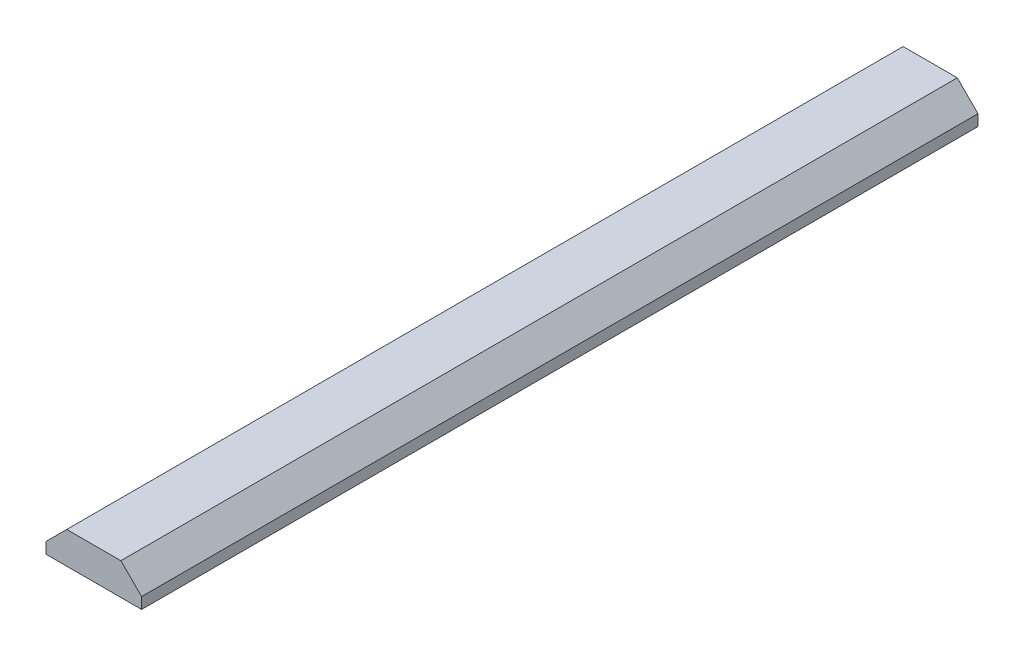
ISO-10303-21;
HEADER;
FILE_DESCRIPTION(('STEP AP214'),'2;1');
FILE_NAME('part.step','',(''),(''),'','','');
FILE_SCHEMA(('AUTOMOTIVE_DESIGN { 1 0 10303 214 1 1 1 1 }'));
ENDSEC;
DATA;
#1=APPLICATION_CONTEXT('core data for automotive mechanical design processes');
#2=APPLICATION_PROTOCOL_DEFINITION('international standard','automotive_design',2000,#1);
#3=PRODUCT_CONTEXT('',#1,'mechanical');
#4=PRODUCT('Part','Part','',(#3));
#5=PRODUCT_RELATED_PRODUCT_CATEGORY('part','',(#4));
#6=PRODUCT_DEFINITION_FORMATION('','',#4);
#7=PRODUCT_DEFINITION_CONTEXT('part definition',#1,'design');
#8=PRODUCT_DEFINITION('design','',#6,#7);
#9=PRODUCT_DEFINITION_SHAPE('','',#8);
#10=(LENGTH_UNIT() NAMED_UNIT(*) SI_UNIT(.MILLI.,.METRE.));
#11=(NAMED_UNIT(*) PLANE_ANGLE_UNIT() SI_UNIT($,.RADIAN.));
#12=(NAMED_UNIT(*) SI_UNIT($,.STERADIAN.) SOLID_ANGLE_UNIT());
#13=UNCERTAINTY_MEASURE_WITH_UNIT(LENGTH_MEASURE(1.E-05),#10,'distance_accuracy_value','');
#14=(GEOMETRIC_REPRESENTATION_CONTEXT(3) GLOBAL_UNCERTAINTY_ASSIGNED_CONTEXT((#13)) GLOBAL_UNIT_ASSIGNED_CONTEXT((#10,
#11,#12)) REPRESENTATION_CONTEXT('',''));
#15=CARTESIAN_POINT('',(0.,0.,0.));
#16=DIRECTION('',(0.,0.,1.));
#17=DIRECTION('',(1.,0.,0.));
#18=AXIS2_PLACEMENT_3D('',#15,#16,#17);
#19=CARTESIAN_POINT('',(3.4,1.80885878693797,105.));
#20=DIRECTION('',(0.707106781186549,0.707106781186546,0.));
#21=DIRECTION('',(-0.707106781186546,0.707106781186549,0.));
#22=AXIS2_PLACEMENT_3D('',#19,#20,#21);
#23=PLANE('',#22);
#24=DIRECTION('',(0.707106781186546,-0.707106781186549,0.));
#25=VECTOR('',#24,1.);
#26=CARTESIAN_POINT('',(3.4,1.80885878693797,0.));
#27=LINE('',#26,#25);
#28=CARTESIAN_POINT('',(3.4,1.80885878693797,0.));
#29=VERTEX_POINT('',#28);
#30=CARTESIAN_POINT('',(6.,-0.791141213062042,0.));
#31=VERTEX_POINT('',#30);
#32=EDGE_CURVE('E127',#29,#31,#27,.T.);
#33=ORIENTED_EDGE('',*,*,#32,.F.);
#34=DIRECTION('',(0.,0.,-1.));
#35=VECTOR('',#34,1.);
#36=CARTESIAN_POINT('',(3.4,1.80885878693797,105.));
#37=LINE('',#36,#35);
#38=CARTESIAN_POINT('',(3.4,1.80885878693797,105.));
#39=VERTEX_POINT('',#38);
#40=EDGE_CURVE('E11',#39,#29,#37,.T.);
#41=ORIENTED_EDGE('',*,*,#40,.F.);
#42=DIRECTION('',(0.707106781186546,-0.707106781186549,0.));
#43=VECTOR('',#42,1.);
#44=CARTESIAN_POINT('',(3.4,1.80885878693797,105.));
#45=LINE('',#44,#43);
#46=CARTESIAN_POINT('',(6.,-0.791141213062042,105.));
#47=VERTEX_POINT('',#46);
#48=EDGE_CURVE('E139',#39,#47,#45,.T.);
#49=ORIENTED_EDGE('',*,*,#48,.T.);
#50=DIRECTION('',(0.,0.,-1.));
#51=VECTOR('',#50,1.);
#52=CARTESIAN_POINT('',(6.,-0.791141213062042,105.));
#53=LINE('',#52,#51);
#54=EDGE_CURVE('E44',#47,#31,#53,.T.);
#55=ORIENTED_EDGE('',*,*,#54,.T.);
#56=EDGE_LOOP('',(#33,#41,#49,#55));
#57=FACE_BOUND('',#56,.T.);
#58=ADVANCED_FACE('F41',(#57),#23,.T.);
#59=CARTESIAN_POINT('',(3.4,1.80885878693797,105.));
#60=DIRECTION('',(0.,-1.,0.));
#61=DIRECTION('',(0.,0.,-1.));
#62=AXIS2_PLACEMENT_3D('',#59,#60,#61);
#63=PLANE('',#62);
#64=DIRECTION('',(-1.,0.,0.));
#65=VECTOR('',#64,1.);
#66=CARTESIAN_POINT('',(3.4,1.80885878693797,0.));
#67=LINE('',#66,#65);
#68=CARTESIAN_POINT('',(-3.4,1.80885878693797,0.));
#69=VERTEX_POINT('',#68);
#70=EDGE_CURVE('E80',#29,#69,#67,.T.);
#71=ORIENTED_EDGE('',*,*,#70,.T.);
#72=DIRECTION('',(0.,0.,-1.));
#73=VECTOR('',#72,1.);
#74=CARTESIAN_POINT('',(-3.4,1.80885878693797,105.));
#75=LINE('',#74,#73);
#76=CARTESIAN_POINT('',(-3.4,1.80885878693797,105.));
#77=VERTEX_POINT('',#76);
#78=EDGE_CURVE('E50',#77,#69,#75,.T.);
#79=ORIENTED_EDGE('',*,*,#78,.F.);
#80=DIRECTION('',(-1.,0.,0.));
#81=VECTOR('',#80,1.);
#82=CARTESIAN_POINT('',(3.4,1.80885878693797,105.));
#83=LINE('',#82,#81);
#84=EDGE_CURVE('E105',#39,#77,#83,.T.);
#85=ORIENTED_EDGE('',*,*,#84,.F.);
#86=ORIENTED_EDGE('',*,*,#40,.T.);
#87=EDGE_LOOP('',(#71,#79,#85,#86));
#88=FACE_BOUND('',#87,.T.);
#89=ADVANCED_FACE('F159',(#88),#63,.F.);
#90=CARTESIAN_POINT('',(-3.4,1.80885878693797,105.));
#91=DIRECTION('',(0.707106781186549,-0.707106781186546,0.));
#92=DIRECTION('',(0.707106781186546,0.707106781186549,0.));
#93=AXIS2_PLACEMENT_3D('',#90,#91,#92);
#94=PLANE('',#93);
#95=DIRECTION('',(-0.707106781186546,-0.707106781186549,0.));
#96=VECTOR('',#95,1.);
#97=CARTESIAN_POINT('',(-3.4,1.80885878693797,0.));
#98=LINE('',#97,#96);
#99=CARTESIAN_POINT('',(-6.,-0.791141213062042,0.));
#100=VERTEX_POINT('',#99);
#101=EDGE_CURVE('E112',#69,#100,#98,.T.);
#102=ORIENTED_EDGE('',*,*,#101,.T.);
#103=DIRECTION('',(0.,0.,-1.));
#104=VECTOR('',#103,1.);
#105=CARTESIAN_POINT('',(-6.,-0.791141213062042,105.));
#106=LINE('',#105,#104);
#107=CARTESIAN_POINT('',(-6.,-0.791141213062042,105.));
#108=VERTEX_POINT('',#107);
#109=EDGE_CURVE('E109',#108,#100,#106,.T.);
#110=ORIENTED_EDGE('',*,*,#109,.F.);
#111=DIRECTION('',(-0.707106781186546,-0.707106781186549,0.));
#112=VECTOR('',#111,1.);
#113=CARTESIAN_POINT('',(-3.4,1.80885878693797,105.));
#114=LINE('',#113,#112);
#115=EDGE_CURVE('E98',#77,#108,#114,.T.);
#116=ORIENTED_EDGE('',*,*,#115,.F.);
#117=ORIENTED_EDGE('',*,*,#78,.T.);
#118=EDGE_LOOP('',(#102,#110,#116,#117));
#119=FACE_BOUND('',#118,.T.);
#120=ADVANCED_FACE('F110',(#119),#94,.F.);
#121=CARTESIAN_POINT('',(-6.,-0.791141213062042,105.));
#122=DIRECTION('',(1.,0.,0.));
#123=DIRECTION('',(0.,0.,-1.));
#124=AXIS2_PLACEMENT_3D('',#121,#122,#123);
#125=PLANE('',#124);
#126=DIRECTION('',(0.,-1.,0.));
#127=VECTOR('',#126,1.);
#128=CARTESIAN_POINT('',(-6.,-0.791141213062042,0.));
#129=LINE('',#128,#127);
#130=CARTESIAN_POINT('',(-6.,-2.19114121306203,0.));
#131=VERTEX_POINT('',#130);
#132=EDGE_CURVE('E136',#100,#131,#129,.T.);
#133=ORIENTED_EDGE('',*,*,#132,.T.);
#134=DIRECTION('',(0.,0.,-1.));
#135=VECTOR('',#134,1.);
#136=CARTESIAN_POINT('',(-6.,-2.19114121306203,105.));
#137=LINE('',#136,#135);
#138=CARTESIAN_POINT('',(-6.,-2.19114121306203,105.));
#139=VERTEX_POINT('',#138);
#140=EDGE_CURVE('E115',#139,#131,#137,.T.);
#141=ORIENTED_EDGE('',*,*,#140,.F.);
#142=DIRECTION('',(0.,-1.,0.));
#143=VECTOR('',#142,1.);
#144=CARTESIAN_POINT('',(-6.,-0.791141213062042,105.));
#145=LINE('',#144,#143);
#146=EDGE_CURVE('E103',#108,#139,#145,.T.);
#147=ORIENTED_EDGE('',*,*,#146,.F.);
#148=ORIENTED_EDGE('',*,*,#109,.T.);
#149=EDGE_LOOP('',(#133,#141,#147,#148));
#150=FACE_BOUND('',#149,.T.);
#151=ADVANCED_FACE('F117',(#150),#125,.F.);
#152=CARTESIAN_POINT('',(-6.,-2.19114121306203,105.));
#153=DIRECTION('',(0.,1.,0.));
#154=DIRECTION('',(0.,0.,1.));
#155=AXIS2_PLACEMENT_3D('',#152,#153,#154);
#156=PLANE('',#155);
#157=DIRECTION('',(1.,0.,0.));
#158=VECTOR('',#157,1.);
#159=CARTESIAN_POINT('',(-6.,-2.19114121306203,0.));
#160=LINE('',#159,#158);
#161=CARTESIAN_POINT('',(6.,-2.19114121306203,0.));
#162=VERTEX_POINT('',#161);
#163=EDGE_CURVE('E133',#131,#162,#160,.T.);
#164=ORIENTED_EDGE('',*,*,#163,.T.);
#165=DIRECTION('',(0.,0.,-1.));
#166=VECTOR('',#165,1.);
#167=CARTESIAN_POINT('',(6.,-2.19114121306203,105.));
#168=LINE('',#167,#166);
#169=CARTESIAN_POINT('',(6.,-2.19114121306203,105.));
#170=VERTEX_POINT('',#169);
#171=EDGE_CURVE('E142',#170,#162,#168,.T.);
#172=ORIENTED_EDGE('',*,*,#171,.F.);
#173=DIRECTION('',(1.,0.,0.));
#174=VECTOR('',#173,1.);
#175=CARTESIAN_POINT('',(-6.,-2.19114121306203,105.));
#176=LINE('',#175,#174);
#177=EDGE_CURVE('E120',#139,#170,#176,.T.);
#178=ORIENTED_EDGE('',*,*,#177,.F.);
#179=ORIENTED_EDGE('',*,*,#140,.T.);
#180=EDGE_LOOP('',(#164,#172,#178,#179));
#181=FACE_BOUND('',#180,.T.);
#182=ADVANCED_FACE('F149',(#181),#156,.F.);
#183=CARTESIAN_POINT('',(6.,-0.791141213062042,105.));
#184=DIRECTION('',(1.,0.,0.));
#185=DIRECTION('',(0.,0.,-1.));
#186=AXIS2_PLACEMENT_3D('',#183,#184,#185);
#187=PLANE('',#186);
#188=DIRECTION('',(0.,-1.,0.));
#189=VECTOR('',#188,1.);
#190=CARTESIAN_POINT('',(6.,-0.791141213062042,0.));
#191=LINE('',#190,#189);
#192=EDGE_CURVE('E130',#31,#162,#191,.T.);
#193=ORIENTED_EDGE('',*,*,#192,.F.);
#194=ORIENTED_EDGE('',*,*,#54,.F.);
#195=DIRECTION('',(0.,-1.,0.));
#196=VECTOR('',#195,1.);
#197=CARTESIAN_POINT('',(6.,-0.791141213062042,105.));
#198=LINE('',#197,#196);
#199=EDGE_CURVE('E122',#47,#170,#198,.T.);
#200=ORIENTED_EDGE('',*,*,#199,.T.);
#201=ORIENTED_EDGE('',*,*,#171,.T.);
#202=EDGE_LOOP('',(#193,#194,#200,#201));
#203=FACE_BOUND('',#202,.T.);
#204=ADVANCED_FACE('F144',(#203),#187,.T.);
#205=CARTESIAN_POINT('',(0.,0.,105.));
#206=DIRECTION('',(0.,0.,-1.));
#207=DIRECTION('',(-1.,0.,0.));
#208=AXIS2_PLACEMENT_3D('',#205,#206,#207);
#209=PLANE('',#208);
#210=ORIENTED_EDGE('',*,*,#48,.F.);
#211=ORIENTED_EDGE('',*,*,#84,.T.);
#212=ORIENTED_EDGE('',*,*,#115,.T.);
#213=ORIENTED_EDGE('',*,*,#146,.T.);
#214=ORIENTED_EDGE('',*,*,#177,.T.);
#215=ORIENTED_EDGE('',*,*,#199,.F.);
#216=EDGE_LOOP('',(#210,#211,#212,#213,#214,#215));
#217=FACE_BOUND('',#216,.T.);
#218=ADVANCED_FACE('F101',(#217),#209,.F.);
#219=CARTESIAN_POINT('',(0.,0.,0.));
#220=DIRECTION('',(0.,0.,-1.));
#221=DIRECTION('',(-1.,0.,0.));
#222=AXIS2_PLACEMENT_3D('',#219,#220,#221);
#223=PLANE('',#222);
#224=ORIENTED_EDGE('',*,*,#32,.T.);
#225=ORIENTED_EDGE('',*,*,#192,.T.);
#226=ORIENTED_EDGE('',*,*,#163,.F.);
#227=ORIENTED_EDGE('',*,*,#132,.F.);
#228=ORIENTED_EDGE('',*,*,#101,.F.);
#229=ORIENTED_EDGE('',*,*,#70,.F.);
#230=EDGE_LOOP('',(#224,#225,#226,#227,#228,#229));
#231=FACE_BOUND('',#230,.T.);
#232=ADVANCED_FACE('F147',(#231),#223,.T.);
#233=CLOSED_SHELL('',(#58,#89,#120,#151,#182,#204,#218,#232));
#234=MANIFOLD_SOLID_BREP('B2',#233);
#235=ADVANCED_BREP_SHAPE_REPRESENTATION('',(#18,#234),#14);
#236=SHAPE_DEFINITION_REPRESENTATION(#9,#235);
ENDSEC;
END-ISO-10303-21;
